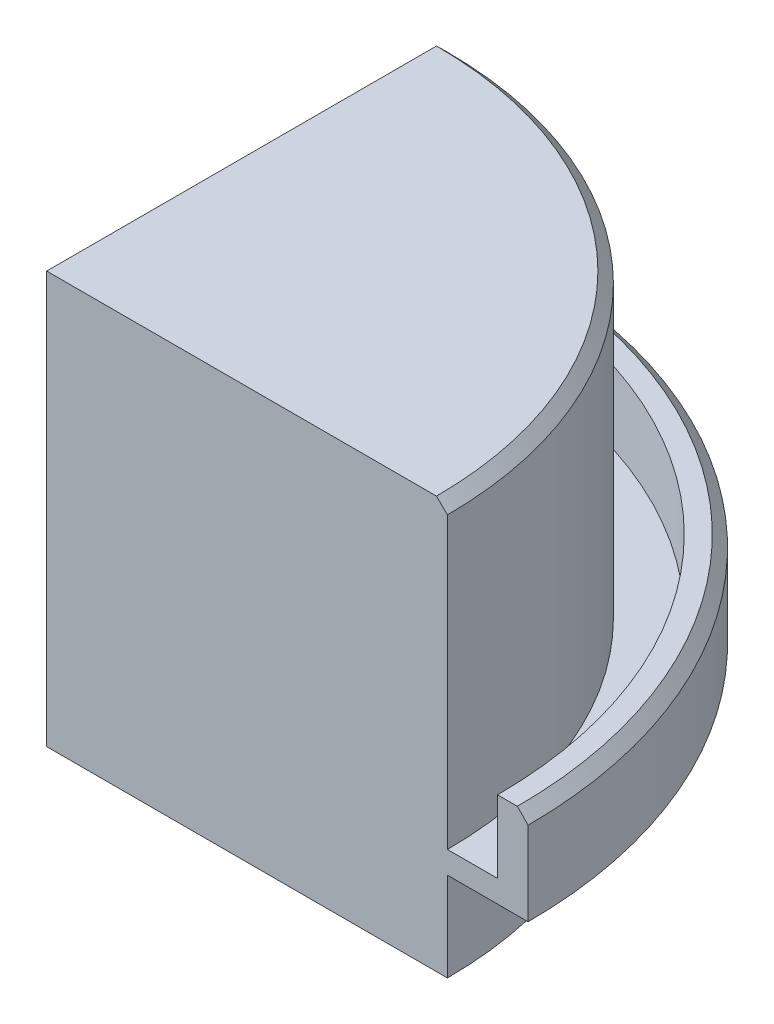
ISO-10303-21;
HEADER;
FILE_DESCRIPTION(('STEP AP214'),'2;1');
FILE_NAME('part.step','',(''),(''),'','','');
FILE_SCHEMA(('AUTOMOTIVE_DESIGN { 1 0 10303 214 1 1 1 1 }'));
ENDSEC;
DATA;
#1=APPLICATION_CONTEXT('core data for automotive mechanical design processes');
#2=APPLICATION_PROTOCOL_DEFINITION('international standard','automotive_design',2000,#1);
#3=PRODUCT_CONTEXT('',#1,'mechanical');
#4=PRODUCT('Part','Part','',(#3));
#5=PRODUCT_RELATED_PRODUCT_CATEGORY('part','',(#4));
#6=PRODUCT_DEFINITION_FORMATION('','',#4);
#7=PRODUCT_DEFINITION_CONTEXT('part definition',#1,'design');
#8=PRODUCT_DEFINITION('design','',#6,#7);
#9=PRODUCT_DEFINITION_SHAPE('','',#8);
#10=(LENGTH_UNIT() NAMED_UNIT(*) SI_UNIT(.MILLI.,.METRE.));
#11=(NAMED_UNIT(*) PLANE_ANGLE_UNIT() SI_UNIT($,.RADIAN.));
#12=(NAMED_UNIT(*) SI_UNIT($,.STERADIAN.) SOLID_ANGLE_UNIT());
#13=UNCERTAINTY_MEASURE_WITH_UNIT(LENGTH_MEASURE(1.E-05),#10,'distance_accuracy_value','');
#14=(GEOMETRIC_REPRESENTATION_CONTEXT(3) GLOBAL_UNCERTAINTY_ASSIGNED_CONTEXT((#13)) GLOBAL_UNIT_ASSIGNED_CONTEXT((#10,
#11,#12)) REPRESENTATION_CONTEXT('',''));
#15=CARTESIAN_POINT('',(0.,0.,0.));
#16=DIRECTION('',(0.,0.,1.));
#17=DIRECTION('',(1.,0.,0.));
#18=AXIS2_PLACEMENT_3D('',#15,#16,#17);
#19=CARTESIAN_POINT('',(0.,18.796,0.));
#20=DIRECTION('',(0.,-1.,0.));
#21=DIRECTION('',(0.,0.,-1.));
#22=AXIS2_PLACEMENT_3D('',#19,#20,#21);
#23=CYLINDRICAL_SURFACE('',#22,21.971);
#24=DIRECTION('',(0.,-1.,0.));
#25=VECTOR('',#24,1.);
#26=CARTESIAN_POINT('',(0.,18.796,-21.971));
#27=LINE('',#26,#25);
#28=CARTESIAN_POINT('',(0.,7.882,-21.971));
#29=VERTEX_POINT('',#28);
#30=CARTESIAN_POINT('',(0.,4.064,-21.971));
#31=VERTEX_POINT('',#30);
#32=EDGE_CURVE('E215',#29,#31,#27,.T.);
#33=ORIENTED_EDGE('',*,*,#32,.F.);
#34=CARTESIAN_POINT('',(0.,7.882,0.));
#35=DIRECTION('',(0.,1.,0.));
#36=DIRECTION('',(0.,0.,1.));
#37=AXIS2_PLACEMENT_3D('',#34,#35,#36);
#38=CIRCLE('',#37,21.971);
#39=CARTESIAN_POINT('',(21.971,7.882,0.));
#40=VERTEX_POINT('',#39);
#41=EDGE_CURVE('E12',#29,#40,#38,.F.);
#42=ORIENTED_EDGE('',*,*,#41,.T.);
#43=DIRECTION('',(0.,-1.,0.));
#44=VECTOR('',#43,1.);
#45=CARTESIAN_POINT('',(21.971,18.796,0.));
#46=LINE('',#45,#44);
#47=CARTESIAN_POINT('',(21.971,4.064,0.));
#48=VERTEX_POINT('',#47);
#49=EDGE_CURVE('E217',#40,#48,#46,.T.);
#50=ORIENTED_EDGE('',*,*,#49,.T.);
#51=CARTESIAN_POINT('',(0.,4.064,0.));
#52=DIRECTION('',(0.,1.,0.));
#53=DIRECTION('',(0.,0.,1.));
#54=AXIS2_PLACEMENT_3D('',#51,#52,#53);
#55=CIRCLE('',#54,21.971);
#56=EDGE_CURVE('E187',#48,#31,#55,.T.);
#57=ORIENTED_EDGE('',*,*,#56,.T.);
#58=EDGE_LOOP('',(#33,#42,#50,#57));
#59=FACE_BOUND('',#58,.T.);
#60=ADVANCED_FACE('F60',(#59),#23,.T.);
#61=CARTESIAN_POINT('',(0.,18.796,0.));
#62=DIRECTION('',(0.,0.,-1.));
#63=DIRECTION('',(-1.,0.,0.));
#64=AXIS2_PLACEMENT_3D('',#61,#62,#63);
#65=PLANE('',#64);
#66=DIRECTION('',(0.,1.,0.));
#67=VECTOR('',#66,1.);
#68=CARTESIAN_POINT('',(18.288,8.382,0.));
#69=LINE('',#68,#67);
#70=CARTESIAN_POINT('',(18.288,5.08,0.));
#71=VERTEX_POINT('',#70);
#72=CARTESIAN_POINT('',(18.288,18.3046514224969,0.));
#73=VERTEX_POINT('',#72);
#74=EDGE_CURVE('E198',#71,#73,#69,.T.);
#75=ORIENTED_EDGE('',*,*,#74,.T.);
#76=DIRECTION('',(0.713250487702889,-0.700909225072399,0.));
#77=VECTOR('',#76,1.);
#78=CARTESIAN_POINT('',(0.,36.2762169932499,0.));
#79=LINE('',#78,#77);
#80=CARTESIAN_POINT('',(17.788,18.796,0.));
#81=VERTEX_POINT('',#80);
#82=EDGE_CURVE('E224',#73,#81,#79,.F.);
#83=ORIENTED_EDGE('',*,*,#82,.T.);
#84=DIRECTION('',(1.,0.,0.));
#85=VECTOR('',#84,1.);
#86=CARTESIAN_POINT('',(0.,18.796,0.));
#87=LINE('',#86,#85);
#88=CARTESIAN_POINT('',(0.,18.796,0.));
#89=VERTEX_POINT('',#88);
#90=EDGE_CURVE('E203',#89,#81,#87,.T.);
#91=ORIENTED_EDGE('',*,*,#90,.F.);
#92=DIRECTION('',(0.,-1.,0.));
#93=VECTOR('',#92,1.);
#94=CARTESIAN_POINT('',(0.,18.796,0.));
#95=LINE('',#94,#93);
#96=CARTESIAN_POINT('',(0.,0.,0.));
#97=VERTEX_POINT('',#96);
#98=EDGE_CURVE('E209',#89,#97,#95,.T.);
#99=ORIENTED_EDGE('',*,*,#98,.T.);
#100=DIRECTION('',(1.,0.,0.));
#101=VECTOR('',#100,1.);
#102=CARTESIAN_POINT('',(0.,0.,0.));
#103=LINE('',#102,#101);
#104=CARTESIAN_POINT('',(18.288,0.,0.));
#105=VERTEX_POINT('',#104);
#106=EDGE_CURVE('E200',#97,#105,#103,.T.);
#107=ORIENTED_EDGE('',*,*,#106,.T.);
#108=DIRECTION('',(0.,-1.,0.));
#109=VECTOR('',#108,1.);
#110=CARTESIAN_POINT('',(18.288,4.064,0.));
#111=LINE('',#110,#109);
#112=CARTESIAN_POINT('',(18.288,4.064,0.));
#113=VERTEX_POINT('',#112);
#114=EDGE_CURVE('E177',#113,#105,#111,.T.);
#115=ORIENTED_EDGE('',*,*,#114,.F.);
#116=DIRECTION('',(1.,0.,0.));
#117=VECTOR('',#116,1.);
#118=CARTESIAN_POINT('',(19.431,4.064,0.));
#119=LINE('',#118,#117);
#120=EDGE_CURVE('E190',#113,#48,#119,.T.);
#121=ORIENTED_EDGE('',*,*,#120,.T.);
#122=ORIENTED_EDGE('',*,*,#49,.F.);
#123=DIRECTION('',(0.700909225072399,-0.71325048770289,0.));
#124=VECTOR('',#123,1.);
#125=CARTESIAN_POINT('',(0.,30.2398544906461,0.));
#126=LINE('',#125,#124);
#127=CARTESIAN_POINT('',(21.4796514224969,8.382,0.));
#128=VERTEX_POINT('',#127);
#129=EDGE_CURVE('E222',#40,#128,#126,.F.);
#130=ORIENTED_EDGE('',*,*,#129,.T.);
#131=DIRECTION('',(1.,0.,0.));
#132=VECTOR('',#131,1.);
#133=CARTESIAN_POINT('',(18.288,8.382,0.));
#134=LINE('',#133,#132);
#135=CARTESIAN_POINT('',(20.574,8.382,0.));
#136=VERTEX_POINT('',#135);
#137=EDGE_CURVE('E193',#136,#128,#134,.T.);
#138=ORIENTED_EDGE('',*,*,#137,.F.);
#139=DIRECTION('',(0.,1.,0.));
#140=VECTOR('',#139,1.);
#141=CARTESIAN_POINT('',(20.574,5.08,0.));
#142=LINE('',#141,#140);
#143=CARTESIAN_POINT('',(20.574,5.08,0.));
#144=VERTEX_POINT('',#143);
#145=EDGE_CURVE('E150',#144,#136,#142,.T.);
#146=ORIENTED_EDGE('',*,*,#145,.F.);
#147=DIRECTION('',(1.,0.,0.));
#148=VECTOR('',#147,1.);
#149=CARTESIAN_POINT('',(18.288,5.08,0.));
#150=LINE('',#149,#148);
#151=EDGE_CURVE('E151',#71,#144,#150,.T.);
#152=ORIENTED_EDGE('',*,*,#151,.F.);
#153=EDGE_LOOP('',(#75,#83,#91,#99,#107,#115,#121,#122,#130,#138,#146,#152));
#154=FACE_BOUND('',#153,.T.);
#155=ADVANCED_FACE('F236',(#154),#65,.F.);
#156=CARTESIAN_POINT('',(0.,18.796,0.));
#157=DIRECTION('',(1.,0.,0.));
#158=DIRECTION('',(0.,0.,-1.));
#159=AXIS2_PLACEMENT_3D('',#156,#157,#158);
#160=PLANE('',#159);
#161=DIRECTION('',(0.,0.,1.));
#162=VECTOR('',#161,1.);
#163=CARTESIAN_POINT('',(0.,18.796,0.));
#164=LINE('',#163,#162);
#165=CARTESIAN_POINT('',(0.,18.796,-17.788));
#166=VERTEX_POINT('',#165);
#167=EDGE_CURVE('E206',#166,#89,#164,.T.);
#168=ORIENTED_EDGE('',*,*,#167,.F.);
#169=DIRECTION('',(0.,0.700909225072399,0.713250487702889));
#170=VECTOR('',#169,1.);
#171=CARTESIAN_POINT('',(0.,36.2762169932499,0.));
#172=LINE('',#171,#170);
#173=CARTESIAN_POINT('',(0.,18.3046514224969,-18.288));
#174=VERTEX_POINT('',#173);
#175=EDGE_CURVE('E229',#166,#174,#172,.F.);
#176=ORIENTED_EDGE('',*,*,#175,.T.);
#177=DIRECTION('',(0.,1.,0.));
#178=VECTOR('',#177,1.);
#179=CARTESIAN_POINT('',(0.,8.382,-18.288));
#180=LINE('',#179,#178);
#181=CARTESIAN_POINT('',(0.,5.08,-18.288));
#182=VERTEX_POINT('',#181);
#183=EDGE_CURVE('E164',#182,#174,#180,.T.);
#184=ORIENTED_EDGE('',*,*,#183,.F.);
#185=DIRECTION('',(0.,0.,1.));
#186=VECTOR('',#185,1.);
#187=CARTESIAN_POINT('',(0.,5.08,-18.288));
#188=LINE('',#187,#186);
#189=CARTESIAN_POINT('',(0.,5.08,-20.574));
#190=VERTEX_POINT('',#189);
#191=EDGE_CURVE('E157',#190,#182,#188,.T.);
#192=ORIENTED_EDGE('',*,*,#191,.F.);
#193=DIRECTION('',(0.,1.,0.));
#194=VECTOR('',#193,1.);
#195=CARTESIAN_POINT('',(0.,5.08,-20.574));
#196=LINE('',#195,#194);
#197=CARTESIAN_POINT('',(0.,8.382,-20.574));
#198=VERTEX_POINT('',#197);
#199=EDGE_CURVE('E142',#190,#198,#196,.T.);
#200=ORIENTED_EDGE('',*,*,#199,.T.);
#201=DIRECTION('',(0.,0.,1.));
#202=VECTOR('',#201,1.);
#203=CARTESIAN_POINT('',(0.,8.382,-18.288));
#204=LINE('',#203,#202);
#205=CARTESIAN_POINT('',(0.,8.382,-21.4796514224969));
#206=VERTEX_POINT('',#205);
#207=EDGE_CURVE('E196',#206,#198,#204,.T.);
#208=ORIENTED_EDGE('',*,*,#207,.F.);
#209=DIRECTION('',(0.,0.71325048770289,0.700909225072399));
#210=VECTOR('',#209,1.);
#211=CARTESIAN_POINT('',(0.,30.2398544906461,0.));
#212=LINE('',#211,#210);
#213=EDGE_CURVE('E75',#206,#29,#212,.F.);
#214=ORIENTED_EDGE('',*,*,#213,.T.);
#215=ORIENTED_EDGE('',*,*,#32,.T.);
#216=DIRECTION('',(0.,0.,1.));
#217=VECTOR('',#216,1.);
#218=CARTESIAN_POINT('',(0.,4.064,-21.971));
#219=LINE('',#218,#217);
#220=CARTESIAN_POINT('',(0.,4.064,-18.288));
#221=VERTEX_POINT('',#220);
#222=EDGE_CURVE('E183',#31,#221,#219,.T.);
#223=ORIENTED_EDGE('',*,*,#222,.T.);
#224=DIRECTION('',(0.,-1.,0.));
#225=VECTOR('',#224,1.);
#226=CARTESIAN_POINT('',(0.,4.064,-18.288));
#227=LINE('',#226,#225);
#228=CARTESIAN_POINT('',(0.,0.,-18.288));
#229=VERTEX_POINT('',#228);
#230=EDGE_CURVE('E180',#221,#229,#227,.T.);
#231=ORIENTED_EDGE('',*,*,#230,.T.);
#232=DIRECTION('',(0.,0.,1.));
#233=VECTOR('',#232,1.);
#234=CARTESIAN_POINT('',(0.,0.,0.));
#235=LINE('',#234,#233);
#236=EDGE_CURVE('E207',#229,#97,#235,.T.);
#237=ORIENTED_EDGE('',*,*,#236,.T.);
#238=ORIENTED_EDGE('',*,*,#98,.F.);
#239=EDGE_LOOP('',(#168,#176,#184,#192,#200,#208,#214,#215,#223,#231,#237,#238));
#240=FACE_BOUND('',#239,.T.);
#241=ADVANCED_FACE('F162',(#240),#160,.F.);
#242=CARTESIAN_POINT('',(0.,0.,0.));
#243=DIRECTION('',(0.,-1.,0.));
#244=DIRECTION('',(0.,0.,-1.));
#245=AXIS2_PLACEMENT_3D('',#242,#243,#244);
#246=PLANE('',#245);
#247=ORIENTED_EDGE('',*,*,#236,.F.);
#248=CARTESIAN_POINT('',(0.,0.,0.));
#249=DIRECTION('',(0.,-1.,0.));
#250=DIRECTION('',(0.,0.,-1.));
#251=AXIS2_PLACEMENT_3D('',#248,#249,#250);
#252=CIRCLE('',#251,18.288);
#253=EDGE_CURVE('E172',#229,#105,#252,.T.);
#254=ORIENTED_EDGE('',*,*,#253,.T.);
#255=ORIENTED_EDGE('',*,*,#106,.F.);
#256=EDGE_LOOP('',(#247,#254,#255));
#257=FACE_BOUND('',#256,.T.);
#258=ADVANCED_FACE('F249',(#257),#246,.T.);
#259=CARTESIAN_POINT('',(0.,18.796,0.));
#260=DIRECTION('',(0.,-1.,0.));
#261=DIRECTION('',(0.,0.,-1.));
#262=AXIS2_PLACEMENT_3D('',#259,#260,#261);
#263=PLANE('',#262);
#264=ORIENTED_EDGE('',*,*,#90,.T.);
#265=CARTESIAN_POINT('',(0.,18.796,0.));
#266=DIRECTION('',(0.,-1.,0.));
#267=DIRECTION('',(0.,0.,-1.));
#268=AXIS2_PLACEMENT_3D('',#265,#266,#267);
#269=CIRCLE('',#268,17.788);
#270=EDGE_CURVE('E226',#81,#166,#269,.F.);
#271=ORIENTED_EDGE('',*,*,#270,.T.);
#272=ORIENTED_EDGE('',*,*,#167,.T.);
#273=EDGE_LOOP('',(#264,#271,#272));
#274=FACE_BOUND('',#273,.T.);
#275=ADVANCED_FACE('F259',(#274),#263,.F.);
#276=CARTESIAN_POINT('',(0.,8.382,0.));
#277=DIRECTION('',(0.,1.,0.));
#278=DIRECTION('',(0.,0.,1.));
#279=AXIS2_PLACEMENT_3D('',#276,#277,#278);
#280=CYLINDRICAL_SURFACE('',#279,18.288);
#281=ORIENTED_EDGE('',*,*,#183,.T.);
#282=CARTESIAN_POINT('',(0.,18.3046514224969,0.));
#283=DIRECTION('',(0.,-1.,0.));
#284=DIRECTION('',(0.,0.,-1.));
#285=AXIS2_PLACEMENT_3D('',#282,#283,#284);
#286=CIRCLE('',#285,18.288);
#287=EDGE_CURVE('E219',#174,#73,#286,.T.);
#288=ORIENTED_EDGE('',*,*,#287,.T.);
#289=ORIENTED_EDGE('',*,*,#74,.F.);
#290=CARTESIAN_POINT('',(0.,5.08,0.));
#291=DIRECTION('',(0.,-1.,0.));
#292=DIRECTION('',(0.,0.,1.));
#293=AXIS2_PLACEMENT_3D('',#290,#291,#292);
#294=CIRCLE('',#293,18.288);
#295=EDGE_CURVE('E166',#182,#71,#294,.T.);
#296=ORIENTED_EDGE('',*,*,#295,.F.);
#297=EDGE_LOOP('',(#281,#288,#289,#296));
#298=FACE_BOUND('',#297,.T.);
#299=ADVANCED_FACE('F258',(#298),#280,.T.);
#300=CARTESIAN_POINT('',(0.,8.382,0.));
#301=DIRECTION('',(0.,1.,0.));
#302=DIRECTION('',(0.,0.,1.));
#303=AXIS2_PLACEMENT_3D('',#300,#301,#302);
#304=PLANE('',#303);
#305=ORIENTED_EDGE('',*,*,#137,.T.);
#306=CARTESIAN_POINT('',(0.,8.382,0.));
#307=DIRECTION('',(0.,1.,0.));
#308=DIRECTION('',(0.,0.,1.));
#309=AXIS2_PLACEMENT_3D('',#306,#307,#308);
#310=CIRCLE('',#309,21.4796514224969);
#311=EDGE_CURVE('E68',#128,#206,#310,.T.);
#312=ORIENTED_EDGE('',*,*,#311,.T.);
#313=ORIENTED_EDGE('',*,*,#207,.T.);
#314=CARTESIAN_POINT('',(0.,8.382,0.));
#315=DIRECTION('',(0.,1.,0.));
#316=DIRECTION('',(0.,0.,1.));
#317=AXIS2_PLACEMENT_3D('',#314,#315,#316);
#318=CIRCLE('',#317,20.574);
#319=EDGE_CURVE('E148',#136,#198,#318,.T.);
#320=ORIENTED_EDGE('',*,*,#319,.F.);
#321=EDGE_LOOP('',(#305,#312,#313,#320));
#322=FACE_BOUND('',#321,.T.);
#323=ADVANCED_FACE('F231',(#322),#304,.T.);
#324=CARTESIAN_POINT('',(0.,4.064,0.));
#325=DIRECTION('',(0.,-1.,0.));
#326=DIRECTION('',(1.,0.,0.));
#327=AXIS2_PLACEMENT_3D('',#324,#325,#326);
#328=PLANE('',#327);
#329=ORIENTED_EDGE('',*,*,#222,.F.);
#330=ORIENTED_EDGE('',*,*,#56,.F.);
#331=ORIENTED_EDGE('',*,*,#120,.F.);
#332=CARTESIAN_POINT('',(0.,4.064,0.));
#333=DIRECTION('',(0.,-1.,0.));
#334=DIRECTION('',(0.,0.,-1.));
#335=AXIS2_PLACEMENT_3D('',#332,#333,#334);
#336=CIRCLE('',#335,18.288);
#337=EDGE_CURVE('E174',#221,#113,#336,.T.);
#338=ORIENTED_EDGE('',*,*,#337,.F.);
#339=EDGE_LOOP('',(#329,#330,#331,#338));
#340=FACE_BOUND('',#339,.T.);
#341=ADVANCED_FACE('F242',(#340),#328,.T.);
#342=CARTESIAN_POINT('',(0.,4.064,0.));
#343=DIRECTION('',(0.,-1.,0.));
#344=DIRECTION('',(0.,0.,-1.));
#345=AXIS2_PLACEMENT_3D('',#342,#343,#344);
#346=CYLINDRICAL_SURFACE('',#345,18.288);
#347=ORIENTED_EDGE('',*,*,#253,.F.);
#348=ORIENTED_EDGE('',*,*,#230,.F.);
#349=ORIENTED_EDGE('',*,*,#337,.T.);
#350=ORIENTED_EDGE('',*,*,#114,.T.);
#351=EDGE_LOOP('',(#347,#348,#349,#350));
#352=FACE_BOUND('',#351,.T.);
#353=ADVANCED_FACE('F285',(#352),#346,.T.);
#354=CARTESIAN_POINT('',(0.,5.08,0.));
#355=DIRECTION('',(0.,1.,0.));
#356=DIRECTION('',(0.,0.,1.));
#357=AXIS2_PLACEMENT_3D('',#354,#355,#356);
#358=CYLINDRICAL_SURFACE('',#357,20.574);
#359=ORIENTED_EDGE('',*,*,#319,.T.);
#360=ORIENTED_EDGE('',*,*,#199,.F.);
#361=CARTESIAN_POINT('',(0.,5.08,0.));
#362=DIRECTION('',(0.,1.,0.));
#363=DIRECTION('',(0.,0.,1.));
#364=AXIS2_PLACEMENT_3D('',#361,#362,#363);
#365=CIRCLE('',#364,20.574);
#366=EDGE_CURVE('E145',#144,#190,#365,.T.);
#367=ORIENTED_EDGE('',*,*,#366,.F.);
#368=ORIENTED_EDGE('',*,*,#145,.T.);
#369=EDGE_LOOP('',(#359,#360,#367,#368));
#370=FACE_BOUND('',#369,.T.);
#371=ADVANCED_FACE('F144',(#370),#358,.F.);
#372=CARTESIAN_POINT('',(0.,5.08,0.));
#373=DIRECTION('',(0.,1.,0.));
#374=DIRECTION('',(0.,0.,1.));
#375=AXIS2_PLACEMENT_3D('',#372,#373,#374);
#376=PLANE('',#375);
#377=ORIENTED_EDGE('',*,*,#366,.T.);
#378=ORIENTED_EDGE('',*,*,#191,.T.);
#379=ORIENTED_EDGE('',*,*,#295,.T.);
#380=ORIENTED_EDGE('',*,*,#151,.T.);
#381=EDGE_LOOP('',(#377,#378,#379,#380));
#382=FACE_BOUND('',#381,.T.);
#383=ADVANCED_FACE('F155',(#382),#376,.T.);
#384=CARTESIAN_POINT('',(0.,18.3046514224969,0.));
#385=DIRECTION('',(0.,-1.,0.));
#386=DIRECTION('',(0.,0.,-1.));
#387=AXIS2_PLACEMENT_3D('',#384,#385,#386);
#388=CONICAL_SURFACE('',#387,18.288,0.794124864655564);
#389=ORIENTED_EDGE('',*,*,#175,.F.);
#390=ORIENTED_EDGE('',*,*,#270,.F.);
#391=ORIENTED_EDGE('',*,*,#82,.F.);
#392=ORIENTED_EDGE('',*,*,#287,.F.);
#393=EDGE_LOOP('',(#389,#390,#391,#392));
#394=FACE_BOUND('',#393,.T.);
#395=ADVANCED_FACE('F256',(#394),#388,.T.);
#396=CARTESIAN_POINT('',(0.,8.382,0.));
#397=DIRECTION('',(0.,-1.,0.));
#398=DIRECTION('',(0.,0.,-1.));
#399=AXIS2_PLACEMENT_3D('',#396,#397,#398);
#400=CONICAL_SURFACE('',#399,21.4796514224969,0.776671462139332);
#401=ORIENTED_EDGE('',*,*,#129,.F.);
#402=ORIENTED_EDGE('',*,*,#41,.F.);
#403=ORIENTED_EDGE('',*,*,#213,.F.);
#404=ORIENTED_EDGE('',*,*,#311,.F.);
#405=EDGE_LOOP('',(#401,#402,#403,#404));
#406=FACE_BOUND('',#405,.T.);
#407=ADVANCED_FACE('F62',(#406),#400,.T.);
#408=CLOSED_SHELL('',(#60,#155,#241,#258,#275,#299,#323,#341,#353,#371,#383,#395,#407));
#409=MANIFOLD_SOLID_BREP('B2',#408);
#410=ADVANCED_BREP_SHAPE_REPRESENTATION('',(#18,#409),#14);
#411=SHAPE_DEFINITION_REPRESENTATION(#9,#410);
ENDSEC;
END-ISO-10303-21;
